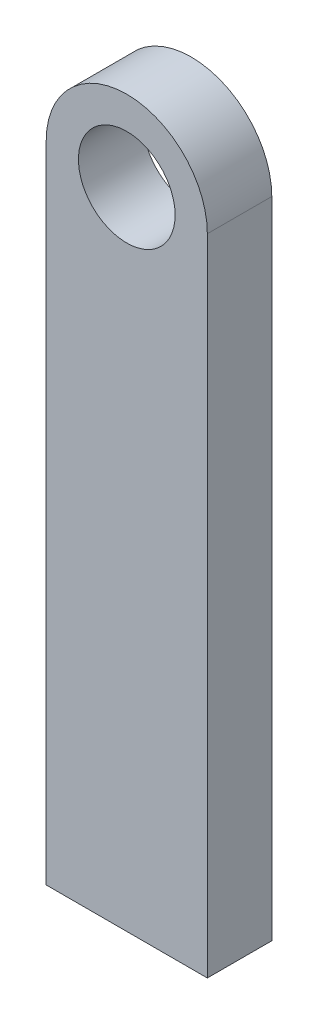
ISO-10303-21;
HEADER;
FILE_DESCRIPTION(('STEP AP214'),'2;1');
FILE_NAME('part.step','',(''),(''),'','','');
FILE_SCHEMA(('AUTOMOTIVE_DESIGN { 1 0 10303 214 1 1 1 1 }'));
ENDSEC;
DATA;
#1=APPLICATION_CONTEXT('core data for automotive mechanical design processes');
#2=APPLICATION_PROTOCOL_DEFINITION('international standard','automotive_design',2000,#1);
#3=PRODUCT_CONTEXT('',#1,'mechanical');
#4=PRODUCT('Part','Part','',(#3));
#5=PRODUCT_RELATED_PRODUCT_CATEGORY('part','',(#4));
#6=PRODUCT_DEFINITION_FORMATION('','',#4);
#7=PRODUCT_DEFINITION_CONTEXT('part definition',#1,'design');
#8=PRODUCT_DEFINITION('design','',#6,#7);
#9=PRODUCT_DEFINITION_SHAPE('','',#8);
#10=(LENGTH_UNIT() NAMED_UNIT(*) SI_UNIT(.MILLI.,.METRE.));
#11=(NAMED_UNIT(*) PLANE_ANGLE_UNIT() SI_UNIT($,.RADIAN.));
#12=(NAMED_UNIT(*) SI_UNIT($,.STERADIAN.) SOLID_ANGLE_UNIT());
#13=UNCERTAINTY_MEASURE_WITH_UNIT(LENGTH_MEASURE(1.E-05),#10,'distance_accuracy_value','');
#14=(GEOMETRIC_REPRESENTATION_CONTEXT(3) GLOBAL_UNCERTAINTY_ASSIGNED_CONTEXT((#13)) GLOBAL_UNIT_ASSIGNED_CONTEXT((#10,
#11,#12)) REPRESENTATION_CONTEXT('',''));
#15=CARTESIAN_POINT('',(0.,0.,0.));
#16=DIRECTION('',(0.,0.,1.));
#17=DIRECTION('',(1.,0.,0.));
#18=AXIS2_PLACEMENT_3D('',#15,#16,#17);
#19=CARTESIAN_POINT('',(0.,0.,2.));
#20=DIRECTION('',(0.,0.,1.));
#21=DIRECTION('',(1.,0.,0.));
#22=AXIS2_PLACEMENT_3D('',#19,#20,#21);
#23=PLANE('',#22);
#24=CARTESIAN_POINT('',(0.,0.,2.));
#25=DIRECTION('',(0.,0.,1.));
#26=DIRECTION('',(1.,0.,0.));
#27=AXIS2_PLACEMENT_3D('',#24,#25,#26);
#28=CIRCLE('',#27,2.5);
#29=CARTESIAN_POINT('',(2.5,0.,2.));
#30=VERTEX_POINT('',#29);
#31=CARTESIAN_POINT('',(-2.5,0.,2.));
#32=VERTEX_POINT('',#31);
#33=EDGE_CURVE('E87',#30,#32,#28,.T.);
#34=ORIENTED_EDGE('',*,*,#33,.T.);
#35=DIRECTION('',(0.,-1.,0.));
#36=VECTOR('',#35,1.);
#37=CARTESIAN_POINT('',(-2.5,0.,2.));
#38=LINE('',#37,#36);
#39=CARTESIAN_POINT('',(-2.5,-20.,2.));
#40=VERTEX_POINT('',#39);
#41=EDGE_CURVE('E82',#32,#40,#38,.T.);
#42=ORIENTED_EDGE('',*,*,#41,.T.);
#43=DIRECTION('',(1.,0.,0.));
#44=VECTOR('',#43,1.);
#45=CARTESIAN_POINT('',(-2.5,-20.,2.));
#46=LINE('',#45,#44);
#47=CARTESIAN_POINT('',(2.5,-20.,2.));
#48=VERTEX_POINT('',#47);
#49=EDGE_CURVE('E85',#40,#48,#46,.T.);
#50=ORIENTED_EDGE('',*,*,#49,.T.);
#51=DIRECTION('',(0.,1.,0.));
#52=VECTOR('',#51,1.);
#53=CARTESIAN_POINT('',(2.5,-20.,2.));
#54=LINE('',#53,#52);
#55=EDGE_CURVE('E52',#48,#30,#54,.T.);
#56=ORIENTED_EDGE('',*,*,#55,.T.);
#57=EDGE_LOOP('',(#34,#42,#50,#56));
#58=FACE_BOUND('',#57,.T.);
#59=CARTESIAN_POINT('',(0.,0.,2.));
#60=DIRECTION('',(0.,0.,1.));
#61=DIRECTION('',(1.,0.,0.));
#62=AXIS2_PLACEMENT_3D('',#59,#60,#61);
#63=CIRCLE('',#62,1.5);
#64=CARTESIAN_POINT('',(1.5,0.,2.));
#65=VERTEX_POINT('',#64);
#66=EDGE_CURVE('E102',#65,#65,#63,.T.);
#67=ORIENTED_EDGE('',*,*,#66,.F.);
#68=EDGE_LOOP('',(#67));
#69=FACE_BOUND('',#68,.T.);
#70=ADVANCED_FACE('F35',(#58,#69),#23,.T.);
#71=CARTESIAN_POINT('',(0.,0.,0.));
#72=DIRECTION('',(0.,0.,1.));
#73=DIRECTION('',(1.,0.,0.));
#74=AXIS2_PLACEMENT_3D('',#71,#72,#73);
#75=PLANE('',#74);
#76=CARTESIAN_POINT('',(0.,0.,0.));
#77=DIRECTION('',(0.,0.,1.));
#78=DIRECTION('',(1.,0.,0.));
#79=AXIS2_PLACEMENT_3D('',#76,#77,#78);
#80=CIRCLE('',#79,2.5);
#81=CARTESIAN_POINT('',(2.5,0.,0.));
#82=VERTEX_POINT('',#81);
#83=CARTESIAN_POINT('',(-2.5,0.,0.));
#84=VERTEX_POINT('',#83);
#85=EDGE_CURVE('E99',#82,#84,#80,.T.);
#86=ORIENTED_EDGE('',*,*,#85,.F.);
#87=DIRECTION('',(0.,1.,0.));
#88=VECTOR('',#87,1.);
#89=CARTESIAN_POINT('',(2.5,-20.,0.));
#90=LINE('',#89,#88);
#91=CARTESIAN_POINT('',(2.5,-20.,0.));
#92=VERTEX_POINT('',#91);
#93=EDGE_CURVE('E75',#92,#82,#90,.T.);
#94=ORIENTED_EDGE('',*,*,#93,.F.);
#95=DIRECTION('',(1.,0.,0.));
#96=VECTOR('',#95,1.);
#97=CARTESIAN_POINT('',(-2.5,-20.,0.));
#98=LINE('',#97,#96);
#99=CARTESIAN_POINT('',(-2.5,-20.,0.));
#100=VERTEX_POINT('',#99);
#101=EDGE_CURVE('E69',#100,#92,#98,.T.);
#102=ORIENTED_EDGE('',*,*,#101,.F.);
#103=DIRECTION('',(0.,-1.,0.));
#104=VECTOR('',#103,1.);
#105=CARTESIAN_POINT('',(-2.5,0.,0.));
#106=LINE('',#105,#104);
#107=EDGE_CURVE('E91',#84,#100,#106,.T.);
#108=ORIENTED_EDGE('',*,*,#107,.F.);
#109=EDGE_LOOP('',(#86,#94,#102,#108));
#110=FACE_BOUND('',#109,.T.);
#111=CARTESIAN_POINT('',(0.,0.,0.));
#112=DIRECTION('',(0.,0.,1.));
#113=DIRECTION('',(1.,0.,0.));
#114=AXIS2_PLACEMENT_3D('',#111,#112,#113);
#115=CIRCLE('',#114,1.5);
#116=CARTESIAN_POINT('',(1.5,0.,0.));
#117=VERTEX_POINT('',#116);
#118=EDGE_CURVE('E114',#117,#117,#115,.T.);
#119=ORIENTED_EDGE('',*,*,#118,.T.);
#120=EDGE_LOOP('',(#119));
#121=FACE_BOUND('',#120,.T.);
#122=ADVANCED_FACE('F110',(#110,#121),#75,.F.);
#123=CARTESIAN_POINT('',(0.,0.,2.));
#124=DIRECTION('',(0.,0.,-1.));
#125=DIRECTION('',(-1.,0.,0.));
#126=AXIS2_PLACEMENT_3D('',#123,#124,#125);
#127=CYLINDRICAL_SURFACE('',#126,2.5);
#128=ORIENTED_EDGE('',*,*,#85,.T.);
#129=DIRECTION('',(0.,0.,-1.));
#130=VECTOR('',#129,1.);
#131=CARTESIAN_POINT('',(-2.5,0.,2.));
#132=LINE('',#131,#130);
#133=EDGE_CURVE('E11',#32,#84,#132,.T.);
#134=ORIENTED_EDGE('',*,*,#133,.F.);
#135=ORIENTED_EDGE('',*,*,#33,.F.);
#136=DIRECTION('',(0.,0.,-1.));
#137=VECTOR('',#136,1.);
#138=CARTESIAN_POINT('',(2.5,0.,2.));
#139=LINE('',#138,#137);
#140=EDGE_CURVE('E95',#30,#82,#139,.T.);
#141=ORIENTED_EDGE('',*,*,#140,.T.);
#142=EDGE_LOOP('',(#128,#134,#135,#141));
#143=FACE_BOUND('',#142,.T.);
#144=ADVANCED_FACE('F37',(#143),#127,.T.);
#145=CARTESIAN_POINT('',(-2.5,0.,2.));
#146=DIRECTION('',(1.,0.,0.));
#147=DIRECTION('',(0.,1.,0.));
#148=AXIS2_PLACEMENT_3D('',#145,#146,#147);
#149=PLANE('',#148);
#150=ORIENTED_EDGE('',*,*,#107,.T.);
#151=DIRECTION('',(0.,0.,-1.));
#152=VECTOR('',#151,1.);
#153=CARTESIAN_POINT('',(-2.5,-20.,2.));
#154=LINE('',#153,#152);
#155=EDGE_CURVE('E44',#40,#100,#154,.T.);
#156=ORIENTED_EDGE('',*,*,#155,.F.);
#157=ORIENTED_EDGE('',*,*,#41,.F.);
#158=ORIENTED_EDGE('',*,*,#133,.T.);
#159=EDGE_LOOP('',(#150,#156,#157,#158));
#160=FACE_BOUND('',#159,.T.);
#161=ADVANCED_FACE('F90',(#160),#149,.F.);
#162=CARTESIAN_POINT('',(-2.5,-20.,2.));
#163=DIRECTION('',(0.,1.,0.));
#164=DIRECTION('',(0.,0.,1.));
#165=AXIS2_PLACEMENT_3D('',#162,#163,#164);
#166=PLANE('',#165);
#167=ORIENTED_EDGE('',*,*,#101,.T.);
#168=DIRECTION('',(0.,0.,-1.));
#169=VECTOR('',#168,1.);
#170=CARTESIAN_POINT('',(2.5,-20.,2.));
#171=LINE('',#170,#169);
#172=EDGE_CURVE('E92',#48,#92,#171,.T.);
#173=ORIENTED_EDGE('',*,*,#172,.F.);
#174=ORIENTED_EDGE('',*,*,#49,.F.);
#175=ORIENTED_EDGE('',*,*,#155,.T.);
#176=EDGE_LOOP('',(#167,#173,#174,#175));
#177=FACE_BOUND('',#176,.T.);
#178=ADVANCED_FACE('F93',(#177),#166,.F.);
#179=CARTESIAN_POINT('',(2.5,-20.,2.));
#180=DIRECTION('',(-1.,0.,0.));
#181=DIRECTION('',(0.,-1.,0.));
#182=AXIS2_PLACEMENT_3D('',#179,#180,#181);
#183=PLANE('',#182);
#184=ORIENTED_EDGE('',*,*,#93,.T.);
#185=ORIENTED_EDGE('',*,*,#140,.F.);
#186=ORIENTED_EDGE('',*,*,#55,.F.);
#187=ORIENTED_EDGE('',*,*,#172,.T.);
#188=EDGE_LOOP('',(#184,#185,#186,#187));
#189=FACE_BOUND('',#188,.T.);
#190=ADVANCED_FACE('F107',(#189),#183,.F.);
#191=CARTESIAN_POINT('',(0.,0.,2.));
#192=DIRECTION('',(0.,0.,-1.));
#193=DIRECTION('',(-1.,0.,0.));
#194=AXIS2_PLACEMENT_3D('',#191,#192,#193);
#195=CYLINDRICAL_SURFACE('',#194,1.5);
#196=ORIENTED_EDGE('',*,*,#66,.T.);
#197=EDGE_LOOP('',(#196));
#198=FACE_BOUND('',#197,.T.);
#199=ORIENTED_EDGE('',*,*,#118,.F.);
#200=EDGE_LOOP('',(#199));
#201=FACE_BOUND('',#200,.T.);
#202=ADVANCED_FACE('F120',(#198,#201),#195,.F.);
#203=CLOSED_SHELL('',(#70,#122,#144,#161,#178,#190,#202));
#204=MANIFOLD_SOLID_BREP('B2',#203);
#205=ADVANCED_BREP_SHAPE_REPRESENTATION('',(#18,#204),#14);
#206=SHAPE_DEFINITION_REPRESENTATION(#9,#205);
ENDSEC;
END-ISO-10303-21;
